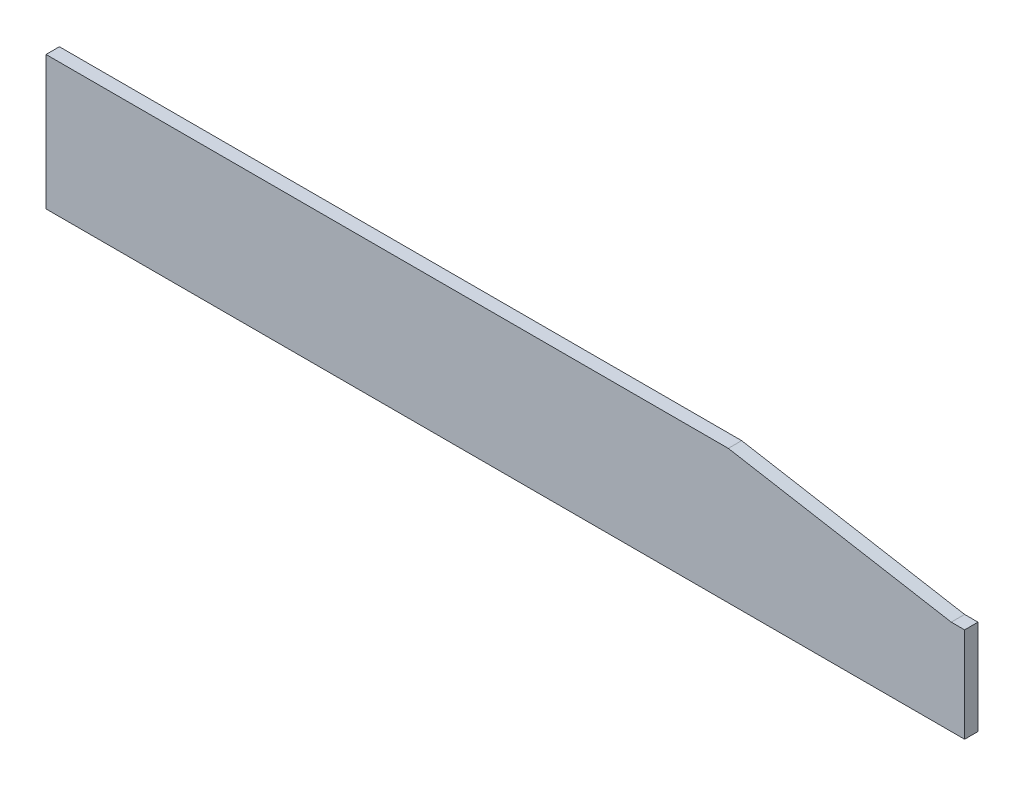
ISO-10303-21;
HEADER;
FILE_DESCRIPTION(('STEP AP214'),'2;1');
FILE_NAME('part.step','',(''),(''),'','','');
FILE_SCHEMA(('AUTOMOTIVE_DESIGN { 1 0 10303 214 1 1 1 1 }'));
ENDSEC;
DATA;
#1=APPLICATION_CONTEXT('core data for automotive mechanical design processes');
#2=APPLICATION_PROTOCOL_DEFINITION('international standard','automotive_design',2000,#1);
#3=PRODUCT_CONTEXT('',#1,'mechanical');
#4=PRODUCT('Part','Part','',(#3));
#5=PRODUCT_RELATED_PRODUCT_CATEGORY('part','',(#4));
#6=PRODUCT_DEFINITION_FORMATION('','',#4);
#7=PRODUCT_DEFINITION_CONTEXT('part definition',#1,'design');
#8=PRODUCT_DEFINITION('design','',#6,#7);
#9=PRODUCT_DEFINITION_SHAPE('','',#8);
#10=(LENGTH_UNIT() NAMED_UNIT(*) SI_UNIT(.MILLI.,.METRE.));
#11=(NAMED_UNIT(*) PLANE_ANGLE_UNIT() SI_UNIT($,.RADIAN.));
#12=(NAMED_UNIT(*) SI_UNIT($,.STERADIAN.) SOLID_ANGLE_UNIT());
#13=UNCERTAINTY_MEASURE_WITH_UNIT(LENGTH_MEASURE(1.E-05),#10,'distance_accuracy_value','');
#14=(GEOMETRIC_REPRESENTATION_CONTEXT(3) GLOBAL_UNCERTAINTY_ASSIGNED_CONTEXT((#13)) GLOBAL_UNIT_ASSIGNED_CONTEXT((#10,
#11,#12)) REPRESENTATION_CONTEXT('',''));
#15=CARTESIAN_POINT('',(0.,0.,0.));
#16=DIRECTION('',(0.,0.,1.));
#17=DIRECTION('',(1.,0.,0.));
#18=AXIS2_PLACEMENT_3D('',#15,#16,#17);
#19=CARTESIAN_POINT('',(222.34476274971,53.378094505597,6.));
#20=DIRECTION('',(0.,-1.,0.));
#21=DIRECTION('',(0.,0.,-1.));
#22=AXIS2_PLACEMENT_3D('',#19,#20,#21);
#23=PLANE('',#22);
#24=DIRECTION('',(-1.,0.,0.));
#25=VECTOR('',#24,1.);
#26=CARTESIAN_POINT('',(222.34476274971,53.378094505597,0.));
#27=LINE('',#26,#25);
#28=CARTESIAN_POINT('',(222.34476274971,53.378094505597,0.));
#29=VERTEX_POINT('',#28);
#30=CARTESIAN_POINT('',(-83.6552372502896,53.378094505597,0.));
#31=VERTEX_POINT('',#30);
#32=EDGE_CURVE('E116',#29,#31,#27,.T.);
#33=ORIENTED_EDGE('',*,*,#32,.T.);
#34=DIRECTION('',(0.,0.,-1.));
#35=VECTOR('',#34,1.);
#36=CARTESIAN_POINT('',(-83.6552372502896,53.378094505597,6.));
#37=LINE('',#36,#35);
#38=CARTESIAN_POINT('',(-83.6552372502896,53.378094505597,6.));
#39=VERTEX_POINT('',#38);
#40=EDGE_CURVE('E11',#39,#31,#37,.T.);
#41=ORIENTED_EDGE('',*,*,#40,.F.);
#42=DIRECTION('',(-1.,0.,0.));
#43=VECTOR('',#42,1.);
#44=CARTESIAN_POINT('',(222.34476274971,53.378094505597,6.));
#45=LINE('',#44,#43);
#46=CARTESIAN_POINT('',(222.34476274971,53.378094505597,6.));
#47=VERTEX_POINT('',#46);
#48=EDGE_CURVE('E126',#47,#39,#45,.T.);
#49=ORIENTED_EDGE('',*,*,#48,.F.);
#50=DIRECTION('',(0.,0.,-1.));
#51=VECTOR('',#50,1.);
#52=CARTESIAN_POINT('',(222.34476274971,53.378094505597,6.));
#53=LINE('',#52,#51);
#54=EDGE_CURVE('E112',#47,#29,#53,.T.);
#55=ORIENTED_EDGE('',*,*,#54,.T.);
#56=EDGE_LOOP('',(#33,#41,#49,#55));
#57=FACE_BOUND('',#56,.T.);
#58=ADVANCED_FACE('F32',(#57),#23,.F.);
#59=CARTESIAN_POINT('',(-83.6552372502896,53.378094505597,6.));
#60=DIRECTION('',(1.,0.,0.));
#61=DIRECTION('',(0.,0.,-1.));
#62=AXIS2_PLACEMENT_3D('',#59,#60,#61);
#63=PLANE('',#62);
#64=DIRECTION('',(0.,-1.,0.));
#65=VECTOR('',#64,1.);
#66=CARTESIAN_POINT('',(-83.6552372502896,53.378094505597,0.));
#67=LINE('',#66,#65);
#68=CARTESIAN_POINT('',(-83.6552372502896,-6.621905494403,0.));
#69=VERTEX_POINT('',#68);
#70=EDGE_CURVE('E119',#31,#69,#67,.T.);
#71=ORIENTED_EDGE('',*,*,#70,.T.);
#72=DIRECTION('',(0.,0.,-1.));
#73=VECTOR('',#72,1.);
#74=CARTESIAN_POINT('',(-83.6552372502896,-6.621905494403,6.));
#75=LINE('',#74,#73);
#76=CARTESIAN_POINT('',(-83.6552372502896,-6.621905494403,6.));
#77=VERTEX_POINT('',#76);
#78=EDGE_CURVE('E40',#77,#69,#75,.T.);
#79=ORIENTED_EDGE('',*,*,#78,.F.);
#80=DIRECTION('',(0.,-1.,0.));
#81=VECTOR('',#80,1.);
#82=CARTESIAN_POINT('',(-83.6552372502896,53.378094505597,6.));
#83=LINE('',#82,#81);
#84=EDGE_CURVE('E85',#39,#77,#83,.T.);
#85=ORIENTED_EDGE('',*,*,#84,.F.);
#86=ORIENTED_EDGE('',*,*,#40,.T.);
#87=EDGE_LOOP('',(#71,#79,#85,#86));
#88=FACE_BOUND('',#87,.T.);
#89=ADVANCED_FACE('F150',(#88),#63,.F.);
#90=CARTESIAN_POINT('',(-83.6552372502896,-6.621905494403,6.));
#91=DIRECTION('',(0.,1.,0.));
#92=DIRECTION('',(0.,0.,1.));
#93=AXIS2_PLACEMENT_3D('',#90,#91,#92);
#94=PLANE('',#93);
#95=DIRECTION('',(1.,0.,0.));
#96=VECTOR('',#95,1.);
#97=CARTESIAN_POINT('',(-83.6552372502896,-6.621905494403,0.));
#98=LINE('',#97,#96);
#99=CARTESIAN_POINT('',(328.34476274971,-6.621905494403,0.));
#100=VERTEX_POINT('',#99);
#101=EDGE_CURVE('E121',#69,#100,#98,.T.);
#102=ORIENTED_EDGE('',*,*,#101,.T.);
#103=DIRECTION('',(0.,0.,-1.));
#104=VECTOR('',#103,1.);
#105=CARTESIAN_POINT('',(328.34476274971,-6.621905494403,6.));
#106=LINE('',#105,#104);
#107=CARTESIAN_POINT('',(328.34476274971,-6.621905494403,6.));
#108=VERTEX_POINT('',#107);
#109=EDGE_CURVE('E107',#108,#100,#106,.T.);
#110=ORIENTED_EDGE('',*,*,#109,.F.);
#111=DIRECTION('',(1.,0.,0.));
#112=VECTOR('',#111,1.);
#113=CARTESIAN_POINT('',(-83.6552372502896,-6.621905494403,6.));
#114=LINE('',#113,#112);
#115=EDGE_CURVE('E98',#77,#108,#114,.T.);
#116=ORIENTED_EDGE('',*,*,#115,.F.);
#117=ORIENTED_EDGE('',*,*,#78,.T.);
#118=EDGE_LOOP('',(#102,#110,#116,#117));
#119=FACE_BOUND('',#118,.T.);
#120=ADVANCED_FACE('F132',(#119),#94,.F.);
#121=CARTESIAN_POINT('',(328.34476274971,-6.621905494403,6.));
#122=DIRECTION('',(-1.,0.,0.));
#123=DIRECTION('',(0.,0.,1.));
#124=AXIS2_PLACEMENT_3D('',#121,#122,#123);
#125=PLANE('',#124);
#126=DIRECTION('',(0.,1.,0.));
#127=VECTOR('',#126,1.);
#128=CARTESIAN_POINT('',(328.34476274971,-6.621905494403,0.));
#129=LINE('',#128,#127);
#130=CARTESIAN_POINT('',(328.34476274971,35.878094505597,0.));
#131=VERTEX_POINT('',#130);
#132=EDGE_CURVE('E106',#100,#131,#129,.T.);
#133=ORIENTED_EDGE('',*,*,#132,.T.);
#134=DIRECTION('',(0.,0.,-1.));
#135=VECTOR('',#134,1.);
#136=CARTESIAN_POINT('',(328.34476274971,35.878094505597,6.));
#137=LINE('',#136,#135);
#138=CARTESIAN_POINT('',(328.34476274971,35.878094505597,6.));
#139=VERTEX_POINT('',#138);
#140=EDGE_CURVE('E103',#139,#131,#137,.T.);
#141=ORIENTED_EDGE('',*,*,#140,.F.);
#142=DIRECTION('',(0.,1.,0.));
#143=VECTOR('',#142,1.);
#144=CARTESIAN_POINT('',(328.34476274971,-6.621905494403,6.));
#145=LINE('',#144,#143);
#146=EDGE_CURVE('E92',#108,#139,#145,.T.);
#147=ORIENTED_EDGE('',*,*,#146,.F.);
#148=ORIENTED_EDGE('',*,*,#109,.T.);
#149=EDGE_LOOP('',(#133,#141,#147,#148));
#150=FACE_BOUND('',#149,.T.);
#151=ADVANCED_FACE('F104',(#150),#125,.F.);
#152=CARTESIAN_POINT('',(328.34476274971,35.878094505597,6.));
#153=DIRECTION('',(0.,-1.,0.));
#154=DIRECTION('',(0.,0.,-1.));
#155=AXIS2_PLACEMENT_3D('',#152,#153,#154);
#156=PLANE('',#155);
#157=DIRECTION('',(-1.,0.,0.));
#158=VECTOR('',#157,1.);
#159=CARTESIAN_POINT('',(328.34476274971,35.878094505597,0.));
#160=LINE('',#159,#158);
#161=CARTESIAN_POINT('',(322.34476274971,35.878094505597,0.));
#162=VERTEX_POINT('',#161);
#163=EDGE_CURVE('E71',#131,#162,#160,.T.);
#164=ORIENTED_EDGE('',*,*,#163,.T.);
#165=DIRECTION('',(0.,0.,-1.));
#166=VECTOR('',#165,1.);
#167=CARTESIAN_POINT('',(322.34476274971,35.878094505597,6.));
#168=LINE('',#167,#166);
#169=CARTESIAN_POINT('',(322.34476274971,35.878094505597,6.));
#170=VERTEX_POINT('',#169);
#171=EDGE_CURVE('E108',#170,#162,#168,.T.);
#172=ORIENTED_EDGE('',*,*,#171,.F.);
#173=DIRECTION('',(-1.,0.,0.));
#174=VECTOR('',#173,1.);
#175=CARTESIAN_POINT('',(328.34476274971,35.878094505597,6.));
#176=LINE('',#175,#174);
#177=EDGE_CURVE('E96',#139,#170,#176,.T.);
#178=ORIENTED_EDGE('',*,*,#177,.F.);
#179=ORIENTED_EDGE('',*,*,#140,.T.);
#180=EDGE_LOOP('',(#164,#172,#178,#179));
#181=FACE_BOUND('',#180,.T.);
#182=ADVANCED_FACE('F110',(#181),#156,.F.);
#183=CARTESIAN_POINT('',(322.34476274971,35.878094505597,6.));
#184=DIRECTION('',(-0.172380331752248,-0.985030467155704,0.));
#185=DIRECTION('',(0.985030467155704,-0.172380331752248,0.));
#186=AXIS2_PLACEMENT_3D('',#183,#184,#185);
#187=PLANE('',#186);
#188=DIRECTION('',(-0.985030467155704,0.172380331752248,0.));
#189=VECTOR('',#188,1.);
#190=CARTESIAN_POINT('',(322.34476274971,35.878094505597,0.));
#191=LINE('',#190,#189);
#192=EDGE_CURVE('E77',#162,#29,#191,.T.);
#193=ORIENTED_EDGE('',*,*,#192,.T.);
#194=ORIENTED_EDGE('',*,*,#54,.F.);
#195=DIRECTION('',(-0.985030467155704,0.172380331752248,0.));
#196=VECTOR('',#195,1.);
#197=CARTESIAN_POINT('',(322.34476274971,35.878094505597,6.));
#198=LINE('',#197,#196);
#199=EDGE_CURVE('E48',#170,#47,#198,.T.);
#200=ORIENTED_EDGE('',*,*,#199,.F.);
#201=ORIENTED_EDGE('',*,*,#171,.T.);
#202=EDGE_LOOP('',(#193,#194,#200,#201));
#203=FACE_BOUND('',#202,.T.);
#204=ADVANCED_FACE('F139',(#203),#187,.F.);
#205=CARTESIAN_POINT('',(0.,0.,6.));
#206=DIRECTION('',(0.,0.,1.));
#207=DIRECTION('',(1.,0.,0.));
#208=AXIS2_PLACEMENT_3D('',#205,#206,#207);
#209=PLANE('',#208);
#210=ORIENTED_EDGE('',*,*,#48,.T.);
#211=ORIENTED_EDGE('',*,*,#84,.T.);
#212=ORIENTED_EDGE('',*,*,#115,.T.);
#213=ORIENTED_EDGE('',*,*,#146,.T.);
#214=ORIENTED_EDGE('',*,*,#177,.T.);
#215=ORIENTED_EDGE('',*,*,#199,.T.);
#216=EDGE_LOOP('',(#210,#211,#212,#213,#214,#215));
#217=FACE_BOUND('',#216,.T.);
#218=ADVANCED_FACE('F94',(#217),#209,.T.);
#219=CARTESIAN_POINT('',(0.,0.,0.));
#220=DIRECTION('',(0.,0.,1.));
#221=DIRECTION('',(1.,0.,0.));
#222=AXIS2_PLACEMENT_3D('',#219,#220,#221);
#223=PLANE('',#222);
#224=ORIENTED_EDGE('',*,*,#32,.F.);
#225=ORIENTED_EDGE('',*,*,#192,.F.);
#226=ORIENTED_EDGE('',*,*,#163,.F.);
#227=ORIENTED_EDGE('',*,*,#132,.F.);
#228=ORIENTED_EDGE('',*,*,#101,.F.);
#229=ORIENTED_EDGE('',*,*,#70,.F.);
#230=EDGE_LOOP('',(#224,#225,#226,#227,#228,#229));
#231=FACE_BOUND('',#230,.T.);
#232=ADVANCED_FACE('F135',(#231),#223,.F.);
#233=CLOSED_SHELL('',(#58,#89,#120,#151,#182,#204,#218,#232));
#234=MANIFOLD_SOLID_BREP('B2',#233);
#235=ADVANCED_BREP_SHAPE_REPRESENTATION('',(#18,#234),#14);
#236=SHAPE_DEFINITION_REPRESENTATION(#9,#235);
ENDSEC;
END-ISO-10303-21;
